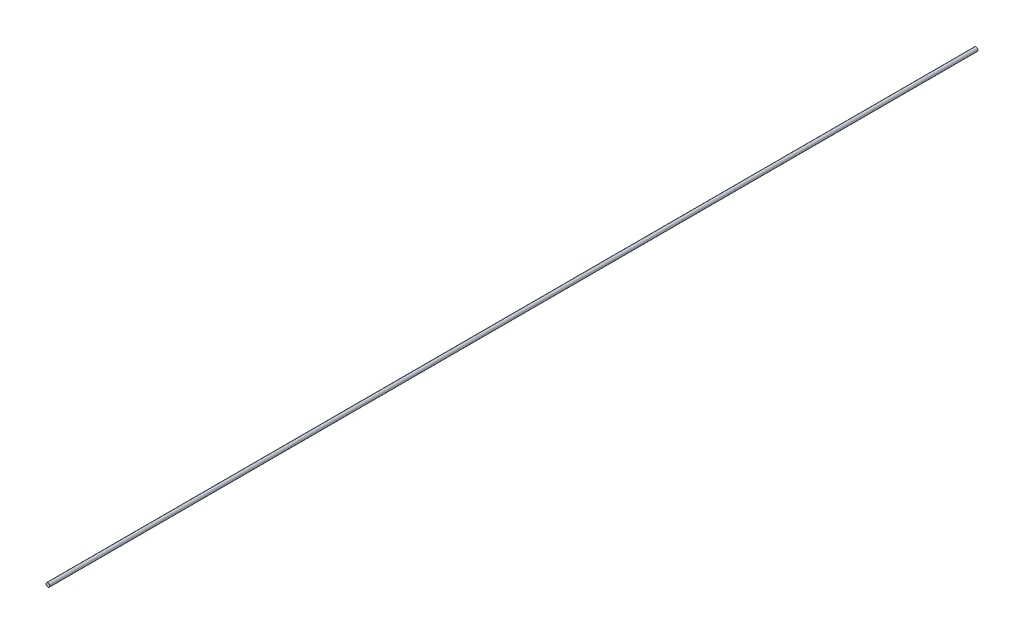
ISO-10303-21;
HEADER;
FILE_DESCRIPTION(('STEP AP214'),'2;1');
FILE_NAME('part.step','',(''),(''),'','','');
FILE_SCHEMA(('AUTOMOTIVE_DESIGN { 1 0 10303 214 1 1 1 1 }'));
ENDSEC;
DATA;
#1=APPLICATION_CONTEXT('core data for automotive mechanical design processes');
#2=APPLICATION_PROTOCOL_DEFINITION('international standard','automotive_design',2000,#1);
#3=PRODUCT_CONTEXT('',#1,'mechanical');
#4=PRODUCT('Part','Part','',(#3));
#5=PRODUCT_RELATED_PRODUCT_CATEGORY('part','',(#4));
#6=PRODUCT_DEFINITION_FORMATION('','',#4);
#7=PRODUCT_DEFINITION_CONTEXT('part definition',#1,'design');
#8=PRODUCT_DEFINITION('design','',#6,#7);
#9=PRODUCT_DEFINITION_SHAPE('','',#8);
#10=(LENGTH_UNIT() NAMED_UNIT(*) SI_UNIT(.MILLI.,.METRE.));
#11=(NAMED_UNIT(*) PLANE_ANGLE_UNIT() SI_UNIT($,.RADIAN.));
#12=(NAMED_UNIT(*) SI_UNIT($,.STERADIAN.) SOLID_ANGLE_UNIT());
#13=UNCERTAINTY_MEASURE_WITH_UNIT(LENGTH_MEASURE(1.E-05),#10,'distance_accuracy_value','');
#14=(GEOMETRIC_REPRESENTATION_CONTEXT(3) GLOBAL_UNCERTAINTY_ASSIGNED_CONTEXT((#13)) GLOBAL_UNIT_ASSIGNED_CONTEXT((#10,
#11,#12)) REPRESENTATION_CONTEXT('',''));
#15=CARTESIAN_POINT('',(0.,0.,0.));
#16=DIRECTION('',(0.,0.,1.));
#17=DIRECTION('',(1.,0.,0.));
#18=AXIS2_PLACEMENT_3D('',#15,#16,#17);
#19=CARTESIAN_POINT('',(0.,0.,914.4));
#20=DIRECTION('',(0.,0.,-1.));
#21=DIRECTION('',(-1.,0.,0.));
#22=AXIS2_PLACEMENT_3D('',#19,#20,#21);
#23=CYLINDRICAL_SURFACE('',#22,1.905);
#24=CARTESIAN_POINT('',(0.,0.,914.4));
#25=DIRECTION('',(0.,0.,1.));
#26=DIRECTION('',(1.,0.,0.));
#27=AXIS2_PLACEMENT_3D('',#24,#25,#26);
#28=CIRCLE('',#27,1.905);
#29=CARTESIAN_POINT('',(1.905,0.,914.4));
#30=VERTEX_POINT('',#29);
#31=EDGE_CURVE('E10',#30,#30,#28,.T.);
#32=ORIENTED_EDGE('',*,*,#31,.F.);
#33=EDGE_LOOP('',(#32));
#34=FACE_BOUND('',#33,.T.);
#35=CARTESIAN_POINT('',(0.,0.,0.));
#36=DIRECTION('',(0.,0.,1.));
#37=DIRECTION('',(1.,0.,0.));
#38=AXIS2_PLACEMENT_3D('',#35,#36,#37);
#39=CIRCLE('',#38,1.905);
#40=CARTESIAN_POINT('',(1.905,0.,0.));
#41=VERTEX_POINT('',#40);
#42=EDGE_CURVE('E37',#41,#41,#39,.T.);
#43=ORIENTED_EDGE('',*,*,#42,.T.);
#44=EDGE_LOOP('',(#43));
#45=FACE_BOUND('',#44,.T.);
#46=ADVANCED_FACE('F34',(#34,#45),#23,.T.);
#47=CARTESIAN_POINT('',(0.,0.,914.4));
#48=DIRECTION('',(0.,0.,1.));
#49=DIRECTION('',(1.,0.,0.));
#50=AXIS2_PLACEMENT_3D('',#47,#48,#49);
#51=PLANE('',#50);
#52=ORIENTED_EDGE('',*,*,#31,.T.);
#53=EDGE_LOOP('',(#52));
#54=FACE_BOUND('',#53,.T.);
#55=ADVANCED_FACE('F49',(#54),#51,.T.);
#56=CARTESIAN_POINT('',(0.,0.,0.));
#57=DIRECTION('',(0.,0.,1.));
#58=DIRECTION('',(1.,0.,0.));
#59=AXIS2_PLACEMENT_3D('',#56,#57,#58);
#60=PLANE('',#59);
#61=ORIENTED_EDGE('',*,*,#42,.F.);
#62=EDGE_LOOP('',(#61));
#63=FACE_BOUND('',#62,.T.);
#64=ADVANCED_FACE('F47',(#63),#60,.F.);
#65=CLOSED_SHELL('',(#46,#55,#64));
#66=MANIFOLD_SOLID_BREP('B2',#65);
#67=ADVANCED_BREP_SHAPE_REPRESENTATION('',(#18,#66),#14);
#68=SHAPE_DEFINITION_REPRESENTATION(#9,#67);
ENDSEC;
END-ISO-10303-21;
